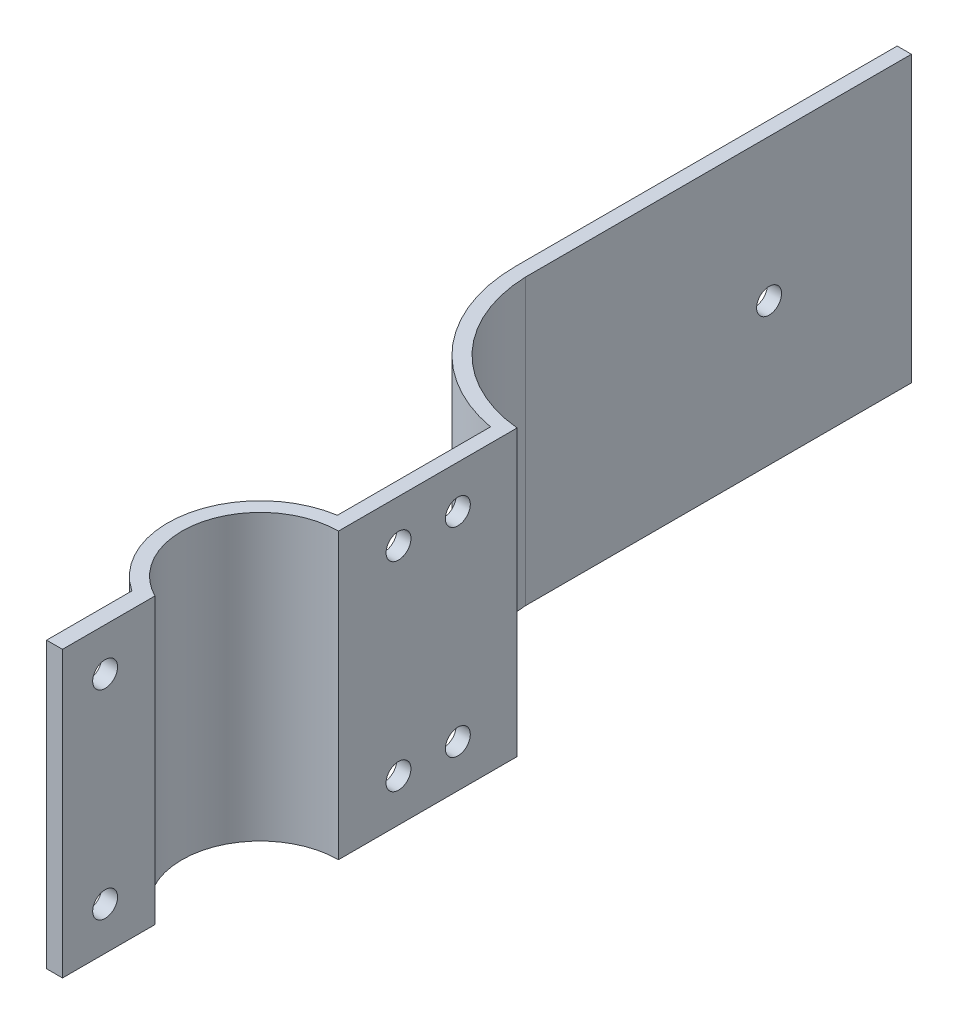
ISO-10303-21;
HEADER;
FILE_DESCRIPTION(('STEP AP214'),'2;1');
FILE_NAME('part.step','',(''),(''),'','','');
FILE_SCHEMA(('AUTOMOTIVE_DESIGN { 1 0 10303 214 1 1 1 1 }'));
ENDSEC;
DATA;
#1=APPLICATION_CONTEXT('core data for automotive mechanical design processes');
#2=APPLICATION_PROTOCOL_DEFINITION('international standard','automotive_design',2000,#1);
#3=PRODUCT_CONTEXT('',#1,'mechanical');
#4=PRODUCT('Part','Part','',(#3));
#5=PRODUCT_RELATED_PRODUCT_CATEGORY('part','',(#4));
#6=PRODUCT_DEFINITION_FORMATION('','',#4);
#7=PRODUCT_DEFINITION_CONTEXT('part definition',#1,'design');
#8=PRODUCT_DEFINITION('design','',#6,#7);
#9=PRODUCT_DEFINITION_SHAPE('','',#8);
#10=(LENGTH_UNIT() NAMED_UNIT(*) SI_UNIT(.MILLI.,.METRE.));
#11=(NAMED_UNIT(*) PLANE_ANGLE_UNIT() SI_UNIT($,.RADIAN.));
#12=(NAMED_UNIT(*) SI_UNIT($,.STERADIAN.) SOLID_ANGLE_UNIT());
#13=UNCERTAINTY_MEASURE_WITH_UNIT(LENGTH_MEASURE(1.E-05),#10,'distance_accuracy_value','');
#14=(GEOMETRIC_REPRESENTATION_CONTEXT(3) GLOBAL_UNCERTAINTY_ASSIGNED_CONTEXT((#13)) GLOBAL_UNIT_ASSIGNED_CONTEXT((#10,
#11,#12)) REPRESENTATION_CONTEXT('',''));
#15=CARTESIAN_POINT('',(0.,0.,0.));
#16=DIRECTION('',(0.,0.,1.));
#17=DIRECTION('',(1.,0.,0.));
#18=AXIS2_PLACEMENT_3D('',#15,#16,#17);
#19=CARTESIAN_POINT('',(0.,40.,0.));
#20=DIRECTION('',(0.,-1.,0.));
#21=DIRECTION('',(0.,0.,-1.));
#22=AXIS2_PLACEMENT_3D('',#19,#20,#21);
#23=CYLINDRICAL_SURFACE('',#22,11.);
#24=CARTESIAN_POINT('',(0.,0.,0.));
#25=DIRECTION('',(0.,-1.,0.));
#26=DIRECTION('',(0.,0.,1.));
#27=AXIS2_PLACEMENT_3D('',#24,#25,#26);
#28=CIRCLE('',#27,11.);
#29=CARTESIAN_POINT('',(-4.99999999999999,0.,9.79795897113272));
#30=VERTEX_POINT('',#29);
#31=CARTESIAN_POINT('',(0.,0.,-11.));
#32=VERTEX_POINT('',#31);
#33=EDGE_CURVE('E607',#30,#32,#28,.T.);
#34=ORIENTED_EDGE('',*,*,#33,.T.);
#35=DIRECTION('',(0.,-1.,0.));
#36=VECTOR('',#35,1.);
#37=CARTESIAN_POINT('',(0.,40.,-11.));
#38=LINE('',#37,#36);
#39=CARTESIAN_POINT('',(0.,40.,-11.));
#40=VERTEX_POINT('',#39);
#41=EDGE_CURVE('E129',#40,#32,#38,.T.);
#42=ORIENTED_EDGE('',*,*,#41,.F.);
#43=CARTESIAN_POINT('',(0.,40.,0.));
#44=DIRECTION('',(0.,-1.,0.));
#45=DIRECTION('',(0.,0.,1.));
#46=AXIS2_PLACEMENT_3D('',#43,#44,#45);
#47=CIRCLE('',#46,11.);
#48=CARTESIAN_POINT('',(-4.99999999999999,40.,9.79795897113272));
#49=VERTEX_POINT('',#48);
#50=EDGE_CURVE('E630',#49,#40,#47,.T.);
#51=ORIENTED_EDGE('',*,*,#50,.F.);
#52=DIRECTION('',(0.,-1.,0.));
#53=VECTOR('',#52,1.);
#54=CARTESIAN_POINT('',(-4.99999999999999,40.,9.79795897113272));
#55=LINE('',#54,#53);
#56=EDGE_CURVE('E603',#49,#30,#55,.T.);
#57=ORIENTED_EDGE('',*,*,#56,.T.);
#58=EDGE_LOOP('',(#34,#42,#51,#57));
#59=FACE_BOUND('',#58,.T.);
#60=ADVANCED_FACE('F485',(#59),#23,.F.);
#61=CARTESIAN_POINT('',(0.,40.,-11.));
#62=DIRECTION('',(-1.,0.,0.));
#63=DIRECTION('',(0.,0.,1.));
#64=AXIS2_PLACEMENT_3D('',#61,#62,#63);
#65=PLANE('',#64);
#66=CARTESIAN_POINT('',(0.,34.,-19.4346127644844));
#67=DIRECTION('',(-1.,0.,0.));
#68=DIRECTION('',(0.,0.,1.));
#69=AXIS2_PLACEMENT_3D('',#66,#67,#68);
#70=CIRCLE('',#69,1.75);
#71=CARTESIAN_POINT('',(0.,34.,-17.6846127644844));
#72=VERTEX_POINT('',#71);
#73=EDGE_CURVE('E771',#72,#72,#70,.T.);
#74=ORIENTED_EDGE('',*,*,#73,.T.);
#75=EDGE_LOOP('',(#74));
#76=FACE_BOUND('',#75,.T.);
#77=CARTESIAN_POINT('',(0.,6.,-19.4346127644844));
#78=DIRECTION('',(-1.,0.,0.));
#79=DIRECTION('',(0.,0.,-1.));
#80=AXIS2_PLACEMENT_3D('',#77,#78,#79);
#81=CIRCLE('',#80,1.75);
#82=CARTESIAN_POINT('',(0.,6.,-21.1846127644844));
#83=VERTEX_POINT('',#82);
#84=EDGE_CURVE('E775',#83,#83,#81,.T.);
#85=ORIENTED_EDGE('',*,*,#84,.T.);
#86=EDGE_LOOP('',(#85));
#87=FACE_BOUND('',#86,.T.);
#88=CARTESIAN_POINT('',(0.,6.,-27.7739929503036));
#89=DIRECTION('',(-1.,0.,0.));
#90=DIRECTION('',(0.,0.,-1.));
#91=AXIS2_PLACEMENT_3D('',#88,#89,#90);
#92=CIRCLE('',#91,1.75);
#93=CARTESIAN_POINT('',(0.,6.,-29.5239929503036));
#94=VERTEX_POINT('',#93);
#95=EDGE_CURVE('E777',#94,#94,#92,.T.);
#96=ORIENTED_EDGE('',*,*,#95,.T.);
#97=EDGE_LOOP('',(#96));
#98=FACE_BOUND('',#97,.T.);
#99=CARTESIAN_POINT('',(0.,34.,-27.7739929503036));
#100=DIRECTION('',(-1.,0.,0.));
#101=DIRECTION('',(0.,0.,1.));
#102=AXIS2_PLACEMENT_3D('',#99,#100,#101);
#103=CIRCLE('',#102,1.75);
#104=CARTESIAN_POINT('',(0.,34.,-26.0239929503036));
#105=VERTEX_POINT('',#104);
#106=EDGE_CURVE('E658',#105,#105,#103,.T.);
#107=ORIENTED_EDGE('',*,*,#106,.T.);
#108=EDGE_LOOP('',(#107));
#109=FACE_BOUND('',#108,.T.);
#110=DIRECTION('',(0.,0.,-1.));
#111=VECTOR('',#110,1.);
#112=CARTESIAN_POINT('',(0.,0.,-11.));
#113=LINE('',#112,#111);
#114=CARTESIAN_POINT('',(0.,0.,-36.0988023049347));
#115=VERTEX_POINT('',#114);
#116=EDGE_CURVE('E610',#32,#115,#113,.T.);
#117=ORIENTED_EDGE('',*,*,#116,.T.);
#118=DIRECTION('',(0.,-1.,0.));
#119=VECTOR('',#118,1.);
#120=CARTESIAN_POINT('',(0.,40.,-36.0988023049347));
#121=LINE('',#120,#119);
#122=CARTESIAN_POINT('',(0.,40.,-36.0988023049347));
#123=VERTEX_POINT('',#122);
#124=EDGE_CURVE('E494',#123,#115,#121,.T.);
#125=ORIENTED_EDGE('',*,*,#124,.F.);
#126=DIRECTION('',(0.,0.,-1.));
#127=VECTOR('',#126,1.);
#128=CARTESIAN_POINT('',(0.,40.,-11.));
#129=LINE('',#128,#127);
#130=EDGE_CURVE('E558',#40,#123,#129,.T.);
#131=ORIENTED_EDGE('',*,*,#130,.F.);
#132=ORIENTED_EDGE('',*,*,#41,.T.);
#133=EDGE_LOOP('',(#117,#125,#131,#132));
#134=FACE_BOUND('',#133,.T.);
#135=ADVANCED_FACE('F725',(#76,#87,#98,#109,#134),#65,.F.);
#136=CARTESIAN_POINT('',(1.91437516293724,40.,-55.7074706610221));
#137=DIRECTION('',(0.,-1.,0.));
#138=DIRECTION('',(0.,0.,-1.));
#139=AXIS2_PLACEMENT_3D('',#136,#137,#138);
#140=CYLINDRICAL_SURFACE('',#139,19.7018960245834);
#141=CARTESIAN_POINT('',(1.91437516293724,0.,-55.7074706610221));
#142=DIRECTION('',(0.,-1.,0.));
#143=DIRECTION('',(0.,0.,-1.));
#144=AXIS2_PLACEMENT_3D('',#141,#142,#143);
#145=CIRCLE('',#144,19.7018960245834);
#146=CARTESIAN_POINT('',(-17.776180483744,0.,-55.0390955504403));
#147=VERTEX_POINT('',#146);
#148=EDGE_CURVE('E613',#115,#147,#145,.T.);
#149=ORIENTED_EDGE('',*,*,#148,.T.);
#150=DIRECTION('',(0.,-1.,0.));
#151=VECTOR('',#150,1.);
#152=CARTESIAN_POINT('',(-17.776180483744,40.,-55.0390955504403));
#153=LINE('',#152,#151);
#154=CARTESIAN_POINT('',(-17.776180483744,40.,-55.0390955504403));
#155=VERTEX_POINT('',#154);
#156=EDGE_CURVE('E649',#155,#147,#153,.T.);
#157=ORIENTED_EDGE('',*,*,#156,.F.);
#158=CARTESIAN_POINT('',(1.91437516293724,40.,-55.7074706610221));
#159=DIRECTION('',(0.,-1.,0.));
#160=DIRECTION('',(0.,0.,-1.));
#161=AXIS2_PLACEMENT_3D('',#158,#159,#160);
#162=CIRCLE('',#161,19.7018960245834);
#163=EDGE_CURVE('E684',#123,#155,#162,.T.);
#164=ORIENTED_EDGE('',*,*,#163,.F.);
#165=ORIENTED_EDGE('',*,*,#124,.T.);
#166=EDGE_LOOP('',(#149,#157,#164,#165));
#167=FACE_BOUND('',#166,.T.);
#168=ADVANCED_FACE('F729',(#167),#140,.F.);
#169=CARTESIAN_POINT('',(-17.776180483744,40.,-109.287361941158));
#170=DIRECTION('',(-1.,0.,0.));
#171=DIRECTION('',(0.,0.,1.));
#172=AXIS2_PLACEMENT_3D('',#169,#170,#171);
#173=PLANE('',#172);
#174=CARTESIAN_POINT('',(-17.776180483744,20.,-89.2873619411582));
#175=DIRECTION('',(-1.,0.,0.));
#176=DIRECTION('',(0.,0.,1.));
#177=AXIS2_PLACEMENT_3D('',#174,#175,#176);
#178=CIRCLE('',#177,1.75);
#179=CARTESIAN_POINT('',(-17.776180483744,20.,-87.5373619411581));
#180=VERTEX_POINT('',#179);
#181=EDGE_CURVE('E611',#180,#180,#178,.T.);
#182=ORIENTED_EDGE('',*,*,#181,.T.);
#183=EDGE_LOOP('',(#182));
#184=FACE_BOUND('',#183,.T.);
#185=DIRECTION('',(0.,0.,-1.));
#186=VECTOR('',#185,1.);
#187=CARTESIAN_POINT('',(-17.776180483744,0.,-109.287361941158));
#188=LINE('',#187,#186);
#189=CARTESIAN_POINT('',(-17.776180483744,0.,-109.287361941158));
#190=VERTEX_POINT('',#189);
#191=EDGE_CURVE('E615',#147,#190,#188,.T.);
#192=ORIENTED_EDGE('',*,*,#191,.T.);
#193=DIRECTION('',(0.,-1.,0.));
#194=VECTOR('',#193,1.);
#195=CARTESIAN_POINT('',(-17.776180483744,40.,-109.287361941158));
#196=LINE('',#195,#194);
#197=CARTESIAN_POINT('',(-17.776180483744,40.,-109.287361941158));
#198=VERTEX_POINT('',#197);
#199=EDGE_CURVE('E646',#198,#190,#196,.T.);
#200=ORIENTED_EDGE('',*,*,#199,.F.);
#201=DIRECTION('',(0.,0.,-1.));
#202=VECTOR('',#201,1.);
#203=CARTESIAN_POINT('',(-17.776180483744,40.,-109.287361941158));
#204=LINE('',#203,#202);
#205=EDGE_CURVE('E686',#155,#198,#204,.T.);
#206=ORIENTED_EDGE('',*,*,#205,.F.);
#207=ORIENTED_EDGE('',*,*,#156,.T.);
#208=EDGE_LOOP('',(#192,#200,#206,#207));
#209=FACE_BOUND('',#208,.T.);
#210=ADVANCED_FACE('F734',(#184,#209),#173,.F.);
#211=CARTESIAN_POINT('',(-19.776180483744,40.,-109.287361941158));
#212=DIRECTION('',(0.,0.,1.));
#213=DIRECTION('',(1.,0.,0.));
#214=AXIS2_PLACEMENT_3D('',#211,#212,#213);
#215=PLANE('',#214);
#216=DIRECTION('',(-1.,0.,0.));
#217=VECTOR('',#216,1.);
#218=CARTESIAN_POINT('',(-19.776180483744,0.,-109.287361941158));
#219=LINE('',#218,#217);
#220=CARTESIAN_POINT('',(-19.776180483744,0.,-109.287361941158));
#221=VERTEX_POINT('',#220);
#222=EDGE_CURVE('E617',#190,#221,#219,.T.);
#223=ORIENTED_EDGE('',*,*,#222,.T.);
#224=DIRECTION('',(0.,-1.,0.));
#225=VECTOR('',#224,1.);
#226=CARTESIAN_POINT('',(-19.776180483744,40.,-109.287361941158));
#227=LINE('',#226,#225);
#228=CARTESIAN_POINT('',(-19.776180483744,40.,-109.287361941158));
#229=VERTEX_POINT('',#228);
#230=EDGE_CURVE('E643',#229,#221,#227,.T.);
#231=ORIENTED_EDGE('',*,*,#230,.F.);
#232=DIRECTION('',(-1.,0.,0.));
#233=VECTOR('',#232,1.);
#234=CARTESIAN_POINT('',(-19.776180483744,40.,-109.287361941158));
#235=LINE('',#234,#233);
#236=EDGE_CURVE('E688',#198,#229,#235,.T.);
#237=ORIENTED_EDGE('',*,*,#236,.F.);
#238=ORIENTED_EDGE('',*,*,#199,.T.);
#239=EDGE_LOOP('',(#223,#231,#237,#238));
#240=FACE_BOUND('',#239,.T.);
#241=ADVANCED_FACE('F742',(#240),#215,.F.);
#242=CARTESIAN_POINT('',(-19.776180483744,40.,-55.700978031366));
#243=DIRECTION('',(1.,0.,0.));
#244=DIRECTION('',(0.,0.,-1.));
#245=AXIS2_PLACEMENT_3D('',#242,#243,#244);
#246=PLANE('',#245);
#247=CARTESIAN_POINT('',(-19.776180483744,20.,-89.2873619411582));
#248=DIRECTION('',(-1.,0.,0.));
#249=DIRECTION('',(0.,0.,1.));
#250=AXIS2_PLACEMENT_3D('',#247,#248,#249);
#251=CIRCLE('',#250,1.75);
#252=CARTESIAN_POINT('',(-19.776180483744,20.,-87.5373619411581));
#253=VERTEX_POINT('',#252);
#254=EDGE_CURVE('E772',#253,#253,#251,.T.);
#255=ORIENTED_EDGE('',*,*,#254,.F.);
#256=EDGE_LOOP('',(#255));
#257=FACE_BOUND('',#256,.T.);
#258=DIRECTION('',(0.,0.,1.));
#259=VECTOR('',#258,1.);
#260=CARTESIAN_POINT('',(-19.776180483744,0.,-55.700978031366));
#261=LINE('',#260,#259);
#262=CARTESIAN_POINT('',(-19.776180483744,0.,-55.700978031366));
#263=VERTEX_POINT('',#262);
#264=EDGE_CURVE('E619',#221,#263,#261,.T.);
#265=ORIENTED_EDGE('',*,*,#264,.T.);
#266=DIRECTION('',(0.,-1.,0.));
#267=VECTOR('',#266,1.);
#268=CARTESIAN_POINT('',(-19.776180483744,40.,-55.700978031366));
#269=LINE('',#268,#267);
#270=CARTESIAN_POINT('',(-19.776180483744,40.,-55.700978031366));
#271=VERTEX_POINT('',#270);
#272=EDGE_CURVE('E640',#271,#263,#269,.T.);
#273=ORIENTED_EDGE('',*,*,#272,.F.);
#274=DIRECTION('',(0.,0.,1.));
#275=VECTOR('',#274,1.);
#276=CARTESIAN_POINT('',(-19.776180483744,40.,-55.700978031366));
#277=LINE('',#276,#275);
#278=EDGE_CURVE('E690',#229,#271,#277,.T.);
#279=ORIENTED_EDGE('',*,*,#278,.F.);
#280=ORIENTED_EDGE('',*,*,#230,.T.);
#281=EDGE_LOOP('',(#265,#273,#279,#280));
#282=FACE_BOUND('',#281,.T.);
#283=ADVANCED_FACE('F745',(#257,#282),#246,.F.);
#284=CARTESIAN_POINT('',(1.91818676127452,40.,-55.700978031366));
#285=DIRECTION('',(0.,-1.,0.));
#286=DIRECTION('',(0.,0.,-1.));
#287=AXIS2_PLACEMENT_3D('',#284,#285,#286);
#288=CYLINDRICAL_SURFACE('',#287,21.6943672450185);
#289=CARTESIAN_POINT('',(1.91818676127452,0.,-55.700978031366));
#290=DIRECTION('',(0.,1.,0.));
#291=DIRECTION('',(0.,0.,-1.));
#292=AXIS2_PLACEMENT_3D('',#289,#290,#291);
#293=CIRCLE('',#292,21.6943672450185);
#294=CARTESIAN_POINT('',(-1.99999999999999,0.,-34.3633731361228));
#295=VERTEX_POINT('',#294);
#296=EDGE_CURVE('E621',#263,#295,#293,.T.);
#297=ORIENTED_EDGE('',*,*,#296,.T.);
#298=DIRECTION('',(0.,-1.,0.));
#299=VECTOR('',#298,1.);
#300=CARTESIAN_POINT('',(-1.99999999999999,40.,-34.3633731361228));
#301=LINE('',#300,#299);
#302=CARTESIAN_POINT('',(-1.99999999999999,40.,-34.3633731361228));
#303=VERTEX_POINT('',#302);
#304=EDGE_CURVE('E637',#303,#295,#301,.T.);
#305=ORIENTED_EDGE('',*,*,#304,.F.);
#306=CARTESIAN_POINT('',(1.91818676127452,40.,-55.700978031366));
#307=DIRECTION('',(0.,1.,0.));
#308=DIRECTION('',(0.,0.,-1.));
#309=AXIS2_PLACEMENT_3D('',#306,#307,#308);
#310=CIRCLE('',#309,21.6943672450185);
#311=EDGE_CURVE('E692',#271,#303,#310,.T.);
#312=ORIENTED_EDGE('',*,*,#311,.F.);
#313=ORIENTED_EDGE('',*,*,#272,.T.);
#314=EDGE_LOOP('',(#297,#305,#312,#313));
#315=FACE_BOUND('',#314,.T.);
#316=ADVANCED_FACE('F749',(#315),#288,.T.);
#317=CARTESIAN_POINT('',(-2.,40.,-12.8452325786651));
#318=DIRECTION('',(1.,0.,0.));
#319=DIRECTION('',(0.,0.,-1.));
#320=AXIS2_PLACEMENT_3D('',#317,#318,#319);
#321=PLANE('',#320);
#322=CARTESIAN_POINT('',(-2.,34.,-19.4346127644844));
#323=DIRECTION('',(1.,0.,0.));
#324=DIRECTION('',(0.,0.,-1.));
#325=AXIS2_PLACEMENT_3D('',#322,#323,#324);
#326=CIRCLE('',#325,1.75);
#327=CARTESIAN_POINT('',(-2.,34.,-21.1846127644844));
#328=VERTEX_POINT('',#327);
#329=EDGE_CURVE('E488',#328,#328,#326,.T.);
#330=ORIENTED_EDGE('',*,*,#329,.T.);
#331=EDGE_LOOP('',(#330));
#332=FACE_BOUND('',#331,.T.);
#333=CARTESIAN_POINT('',(-2.,6.,-19.4346127644844));
#334=DIRECTION('',(1.,0.,0.));
#335=DIRECTION('',(0.,0.,-1.));
#336=AXIS2_PLACEMENT_3D('',#333,#334,#335);
#337=CIRCLE('',#336,1.75);
#338=CARTESIAN_POINT('',(-2.,6.,-21.1846127644844));
#339=VERTEX_POINT('',#338);
#340=EDGE_CURVE('E668',#339,#339,#337,.T.);
#341=ORIENTED_EDGE('',*,*,#340,.T.);
#342=EDGE_LOOP('',(#341));
#343=FACE_BOUND('',#342,.T.);
#344=CARTESIAN_POINT('',(-1.99999999999999,6.,-27.7739929503036));
#345=DIRECTION('',(1.,0.,0.));
#346=DIRECTION('',(0.,0.,-1.));
#347=AXIS2_PLACEMENT_3D('',#344,#345,#346);
#348=CIRCLE('',#347,1.75);
#349=CARTESIAN_POINT('',(-1.99999999999999,6.,-29.5239929503036));
#350=VERTEX_POINT('',#349);
#351=EDGE_CURVE('E666',#350,#350,#348,.T.);
#352=ORIENTED_EDGE('',*,*,#351,.T.);
#353=EDGE_LOOP('',(#352));
#354=FACE_BOUND('',#353,.T.);
#355=CARTESIAN_POINT('',(-1.99999999999999,34.,-27.7739929503036));
#356=DIRECTION('',(1.,0.,0.));
#357=DIRECTION('',(0.,0.,-1.));
#358=AXIS2_PLACEMENT_3D('',#355,#356,#357);
#359=CIRCLE('',#358,1.75);
#360=CARTESIAN_POINT('',(-1.99999999999999,34.,-29.5239929503036));
#361=VERTEX_POINT('',#360);
#362=EDGE_CURVE('E663',#361,#361,#359,.T.);
#363=ORIENTED_EDGE('',*,*,#362,.T.);
#364=EDGE_LOOP('',(#363));
#365=FACE_BOUND('',#364,.T.);
#366=DIRECTION('',(0.,0.,1.));
#367=VECTOR('',#366,1.);
#368=CARTESIAN_POINT('',(-2.,0.,-12.8452325786651));
#369=LINE('',#368,#367);
#370=CARTESIAN_POINT('',(-2.,0.,-12.8452325786651));
#371=VERTEX_POINT('',#370);
#372=EDGE_CURVE('E623',#295,#371,#369,.T.);
#373=ORIENTED_EDGE('',*,*,#372,.T.);
#374=DIRECTION('',(0.,-1.,0.));
#375=VECTOR('',#374,1.);
#376=CARTESIAN_POINT('',(-2.,40.,-12.8452325786651));
#377=LINE('',#376,#375);
#378=CARTESIAN_POINT('',(-2.,40.,-12.8452325786651));
#379=VERTEX_POINT('',#378);
#380=EDGE_CURVE('E634',#379,#371,#377,.T.);
#381=ORIENTED_EDGE('',*,*,#380,.F.);
#382=DIRECTION('',(0.,0.,1.));
#383=VECTOR('',#382,1.);
#384=CARTESIAN_POINT('',(-2.,40.,-12.8452325786651));
#385=LINE('',#384,#383);
#386=EDGE_CURVE('E694',#303,#379,#385,.T.);
#387=ORIENTED_EDGE('',*,*,#386,.F.);
#388=ORIENTED_EDGE('',*,*,#304,.T.);
#389=EDGE_LOOP('',(#373,#381,#387,#388));
#390=FACE_BOUND('',#389,.T.);
#391=ADVANCED_FACE('F700',(#332,#343,#354,#365,#390),#321,.F.);
#392=CARTESIAN_POINT('',(0.,40.,0.));
#393=DIRECTION('',(0.,-1.,0.));
#394=DIRECTION('',(0.,0.,-1.));
#395=AXIS2_PLACEMENT_3D('',#392,#393,#394);
#396=CYLINDRICAL_SURFACE('',#395,13.);
#397=CARTESIAN_POINT('',(0.,0.,0.));
#398=DIRECTION('',(0.,1.,0.));
#399=DIRECTION('',(0.,0.,1.));
#400=AXIS2_PLACEMENT_3D('',#397,#398,#399);
#401=CIRCLE('',#400,13.);
#402=CARTESIAN_POINT('',(-7.23403936183649,0.,10.8013274420971));
#403=VERTEX_POINT('',#402);
#404=EDGE_CURVE('E625',#371,#403,#401,.T.);
#405=ORIENTED_EDGE('',*,*,#404,.T.);
#406=DIRECTION('',(0.,-1.,0.));
#407=VECTOR('',#406,1.);
#408=CARTESIAN_POINT('',(-7.23403936183649,40.,10.8013274420971));
#409=LINE('',#408,#407);
#410=CARTESIAN_POINT('',(-7.23403936183649,40.,10.8013274420971));
#411=VERTEX_POINT('',#410);
#412=EDGE_CURVE('E598',#411,#403,#409,.T.);
#413=ORIENTED_EDGE('',*,*,#412,.F.);
#414=CARTESIAN_POINT('',(0.,40.,0.));
#415=DIRECTION('',(0.,1.,0.));
#416=DIRECTION('',(0.,0.,1.));
#417=AXIS2_PLACEMENT_3D('',#414,#415,#416);
#418=CIRCLE('',#417,13.);
#419=EDGE_CURVE('E589',#379,#411,#418,.T.);
#420=ORIENTED_EDGE('',*,*,#419,.F.);
#421=ORIENTED_EDGE('',*,*,#380,.T.);
#422=EDGE_LOOP('',(#405,#413,#420,#421));
#423=FACE_BOUND('',#422,.T.);
#424=ADVANCED_FACE('F704',(#423),#396,.T.);
#425=CARTESIAN_POINT('',(-7.23403936183649,40.,22.783960597708));
#426=DIRECTION('',(1.,0.,0.));
#427=DIRECTION('',(0.,0.,-1.));
#428=AXIS2_PLACEMENT_3D('',#425,#426,#427);
#429=PLANE('',#428);
#430=CARTESIAN_POINT('',(-7.23403936183649,34.,16.7926440199026));
#431=DIRECTION('',(1.,0.,0.));
#432=DIRECTION('',(0.,0.,-1.));
#433=AXIS2_PLACEMENT_3D('',#430,#431,#432);
#434=CIRCLE('',#433,1.75);
#435=CARTESIAN_POINT('',(-7.23403936183649,34.,15.0426440199026));
#436=VERTEX_POINT('',#435);
#437=EDGE_CURVE('E662',#436,#436,#434,.T.);
#438=ORIENTED_EDGE('',*,*,#437,.T.);
#439=EDGE_LOOP('',(#438));
#440=FACE_BOUND('',#439,.T.);
#441=CARTESIAN_POINT('',(-7.23403936183649,6.,16.7926440199026));
#442=DIRECTION('',(1.,0.,0.));
#443=DIRECTION('',(0.,0.,-1.));
#444=AXIS2_PLACEMENT_3D('',#441,#442,#443);
#445=CIRCLE('',#444,1.75);
#446=CARTESIAN_POINT('',(-7.23403936183649,6.,15.0426440199026));
#447=VERTEX_POINT('',#446);
#448=EDGE_CURVE('E657',#447,#447,#445,.T.);
#449=ORIENTED_EDGE('',*,*,#448,.T.);
#450=EDGE_LOOP('',(#449));
#451=FACE_BOUND('',#450,.T.);
#452=DIRECTION('',(0.,0.,1.));
#453=VECTOR('',#452,1.);
#454=CARTESIAN_POINT('',(-7.23403936183649,0.,22.783960597708));
#455=LINE('',#454,#453);
#456=CARTESIAN_POINT('',(-7.23403936183649,0.,22.783960597708));
#457=VERTEX_POINT('',#456);
#458=EDGE_CURVE('E597',#403,#457,#455,.T.);
#459=ORIENTED_EDGE('',*,*,#458,.T.);
#460=DIRECTION('',(0.,-1.,0.));
#461=VECTOR('',#460,1.);
#462=CARTESIAN_POINT('',(-7.23403936183649,40.,22.783960597708));
#463=LINE('',#462,#461);
#464=CARTESIAN_POINT('',(-7.23403936183649,40.,22.783960597708));
#465=VERTEX_POINT('',#464);
#466=EDGE_CURVE('E594',#465,#457,#463,.T.);
#467=ORIENTED_EDGE('',*,*,#466,.F.);
#468=DIRECTION('',(0.,0.,1.));
#469=VECTOR('',#468,1.);
#470=CARTESIAN_POINT('',(-7.23403936183649,40.,22.783960597708));
#471=LINE('',#470,#469);
#472=EDGE_CURVE('E583',#411,#465,#471,.T.);
#473=ORIENTED_EDGE('',*,*,#472,.F.);
#474=ORIENTED_EDGE('',*,*,#412,.T.);
#475=EDGE_LOOP('',(#459,#467,#473,#474));
#476=FACE_BOUND('',#475,.T.);
#477=ADVANCED_FACE('F595',(#440,#451,#476),#429,.F.);
#478=CARTESIAN_POINT('',(-4.99999999999998,40.,22.783960597708));
#479=DIRECTION('',(0.,0.,-1.));
#480=DIRECTION('',(-1.,0.,0.));
#481=AXIS2_PLACEMENT_3D('',#478,#479,#480);
#482=PLANE('',#481);
#483=DIRECTION('',(1.,0.,0.));
#484=VECTOR('',#483,1.);
#485=CARTESIAN_POINT('',(-4.99999999999998,0.,22.783960597708));
#486=LINE('',#485,#484);
#487=CARTESIAN_POINT('',(-4.99999999999998,0.,22.783960597708));
#488=VERTEX_POINT('',#487);
#489=EDGE_CURVE('E544',#457,#488,#486,.T.);
#490=ORIENTED_EDGE('',*,*,#489,.T.);
#491=DIRECTION('',(0.,-1.,0.));
#492=VECTOR('',#491,1.);
#493=CARTESIAN_POINT('',(-4.99999999999998,40.,22.783960597708));
#494=LINE('',#493,#492);
#495=CARTESIAN_POINT('',(-4.99999999999998,40.,22.783960597708));
#496=VERTEX_POINT('',#495);
#497=EDGE_CURVE('E599',#496,#488,#494,.T.);
#498=ORIENTED_EDGE('',*,*,#497,.F.);
#499=DIRECTION('',(1.,0.,0.));
#500=VECTOR('',#499,1.);
#501=CARTESIAN_POINT('',(-4.99999999999998,40.,22.783960597708));
#502=LINE('',#501,#500);
#503=EDGE_CURVE('E587',#465,#496,#502,.T.);
#504=ORIENTED_EDGE('',*,*,#503,.F.);
#505=ORIENTED_EDGE('',*,*,#466,.T.);
#506=EDGE_LOOP('',(#490,#498,#504,#505));
#507=FACE_BOUND('',#506,.T.);
#508=ADVANCED_FACE('F601',(#507),#482,.F.);
#509=CARTESIAN_POINT('',(-4.99999999999999,40.,9.79795897113272));
#510=DIRECTION('',(-1.,0.,0.));
#511=DIRECTION('',(0.,0.,1.));
#512=AXIS2_PLACEMENT_3D('',#509,#510,#511);
#513=PLANE('',#512);
#514=CARTESIAN_POINT('',(-4.99999999999998,34.,16.7926440199026));
#515=DIRECTION('',(-1.,0.,0.));
#516=DIRECTION('',(0.,0.,1.));
#517=AXIS2_PLACEMENT_3D('',#514,#515,#516);
#518=CIRCLE('',#517,1.75);
#519=CARTESIAN_POINT('',(-4.99999999999998,34.,18.5426440199026));
#520=VERTEX_POINT('',#519);
#521=EDGE_CURVE('E659',#520,#520,#518,.T.);
#522=ORIENTED_EDGE('',*,*,#521,.T.);
#523=EDGE_LOOP('',(#522));
#524=FACE_BOUND('',#523,.T.);
#525=CARTESIAN_POINT('',(-4.99999999999998,6.,16.7926440199026));
#526=DIRECTION('',(-1.,0.,0.));
#527=DIRECTION('',(0.,0.,1.));
#528=AXIS2_PLACEMENT_3D('',#525,#526,#527);
#529=CIRCLE('',#528,1.75);
#530=CARTESIAN_POINT('',(-4.99999999999998,6.,18.5426440199026));
#531=VERTEX_POINT('',#530);
#532=EDGE_CURVE('E654',#531,#531,#529,.T.);
#533=ORIENTED_EDGE('',*,*,#532,.T.);
#534=EDGE_LOOP('',(#533));
#535=FACE_BOUND('',#534,.T.);
#536=DIRECTION('',(0.,0.,-1.));
#537=VECTOR('',#536,1.);
#538=CARTESIAN_POINT('',(-4.99999999999999,0.,9.79795897113272));
#539=LINE('',#538,#537);
#540=EDGE_CURVE('E550',#488,#30,#539,.T.);
#541=ORIENTED_EDGE('',*,*,#540,.T.);
#542=ORIENTED_EDGE('',*,*,#56,.F.);
#543=DIRECTION('',(0.,0.,-1.));
#544=VECTOR('',#543,1.);
#545=CARTESIAN_POINT('',(-4.99999999999999,40.,9.79795897113272));
#546=LINE('',#545,#544);
#547=EDGE_CURVE('E503',#496,#49,#546,.T.);
#548=ORIENTED_EDGE('',*,*,#547,.F.);
#549=ORIENTED_EDGE('',*,*,#497,.T.);
#550=EDGE_LOOP('',(#541,#542,#548,#549));
#551=FACE_BOUND('',#550,.T.);
#552=ADVANCED_FACE('F712',(#524,#535,#551),#513,.F.);
#553=CARTESIAN_POINT('',(0.,40.,0.));
#554=DIRECTION('',(0.,1.,0.));
#555=DIRECTION('',(0.,0.,1.));
#556=AXIS2_PLACEMENT_3D('',#553,#554,#555);
#557=PLANE('',#556);
#558=ORIENTED_EDGE('',*,*,#50,.T.);
#559=ORIENTED_EDGE('',*,*,#130,.T.);
#560=ORIENTED_EDGE('',*,*,#163,.T.);
#561=ORIENTED_EDGE('',*,*,#205,.T.);
#562=ORIENTED_EDGE('',*,*,#236,.T.);
#563=ORIENTED_EDGE('',*,*,#278,.T.);
#564=ORIENTED_EDGE('',*,*,#311,.T.);
#565=ORIENTED_EDGE('',*,*,#386,.T.);
#566=ORIENTED_EDGE('',*,*,#419,.T.);
#567=ORIENTED_EDGE('',*,*,#472,.T.);
#568=ORIENTED_EDGE('',*,*,#503,.T.);
#569=ORIENTED_EDGE('',*,*,#547,.T.);
#570=EDGE_LOOP('',(#558,#559,#560,#561,#562,#563,#564,#565,#566,#567,#568,#569));
#571=FACE_BOUND('',#570,.T.);
#572=ADVANCED_FACE('F585',(#571),#557,.T.);
#573=CARTESIAN_POINT('',(0.,0.,0.));
#574=DIRECTION('',(0.,1.,0.));
#575=DIRECTION('',(0.,0.,1.));
#576=AXIS2_PLACEMENT_3D('',#573,#574,#575);
#577=PLANE('',#576);
#578=ORIENTED_EDGE('',*,*,#33,.F.);
#579=ORIENTED_EDGE('',*,*,#540,.F.);
#580=ORIENTED_EDGE('',*,*,#489,.F.);
#581=ORIENTED_EDGE('',*,*,#458,.F.);
#582=ORIENTED_EDGE('',*,*,#404,.F.);
#583=ORIENTED_EDGE('',*,*,#372,.F.);
#584=ORIENTED_EDGE('',*,*,#296,.F.);
#585=ORIENTED_EDGE('',*,*,#264,.F.);
#586=ORIENTED_EDGE('',*,*,#222,.F.);
#587=ORIENTED_EDGE('',*,*,#191,.F.);
#588=ORIENTED_EDGE('',*,*,#148,.F.);
#589=ORIENTED_EDGE('',*,*,#116,.F.);
#590=EDGE_LOOP('',(#578,#579,#580,#581,#582,#583,#584,#585,#586,#587,#588,#589));
#591=FACE_BOUND('',#590,.T.);
#592=ADVANCED_FACE('F707',(#591),#577,.F.);
#593=CARTESIAN_POINT('',(0.,6.,16.7926440199026));
#594=DIRECTION('',(-1.,0.,0.));
#595=DIRECTION('',(0.,0.,1.));
#596=AXIS2_PLACEMENT_3D('',#593,#594,#595);
#597=CYLINDRICAL_SURFACE('',#596,1.75);
#598=ORIENTED_EDGE('',*,*,#532,.F.);
#599=EDGE_LOOP('',(#598));
#600=FACE_BOUND('',#599,.T.);
#601=ORIENTED_EDGE('',*,*,#448,.F.);
#602=EDGE_LOOP('',(#601));
#603=FACE_BOUND('',#602,.T.);
#604=ADVANCED_FACE('F804',(#600,#603),#597,.F.);
#605=CARTESIAN_POINT('',(0.,34.,16.7926440199026));
#606=DIRECTION('',(-1.,0.,0.));
#607=DIRECTION('',(0.,0.,1.));
#608=AXIS2_PLACEMENT_3D('',#605,#606,#607);
#609=CYLINDRICAL_SURFACE('',#608,1.75);
#610=ORIENTED_EDGE('',*,*,#521,.F.);
#611=EDGE_LOOP('',(#610));
#612=FACE_BOUND('',#611,.T.);
#613=ORIENTED_EDGE('',*,*,#437,.F.);
#614=EDGE_LOOP('',(#613));
#615=FACE_BOUND('',#614,.T.);
#616=ADVANCED_FACE('F801',(#612,#615),#609,.F.);
#617=CARTESIAN_POINT('',(0.,34.,-27.7739929503036));
#618=DIRECTION('',(-1.,0.,0.));
#619=DIRECTION('',(0.,0.,1.));
#620=AXIS2_PLACEMENT_3D('',#617,#618,#619);
#621=CYLINDRICAL_SURFACE('',#620,1.75);
#622=ORIENTED_EDGE('',*,*,#106,.F.);
#623=EDGE_LOOP('',(#622));
#624=FACE_BOUND('',#623,.T.);
#625=ORIENTED_EDGE('',*,*,#362,.F.);
#626=EDGE_LOOP('',(#625));
#627=FACE_BOUND('',#626,.T.);
#628=ADVANCED_FACE('F797',(#624,#627),#621,.F.);
#629=CARTESIAN_POINT('',(0.,6.,-27.7739929503036));
#630=DIRECTION('',(-1.,0.,0.));
#631=DIRECTION('',(0.,0.,1.));
#632=AXIS2_PLACEMENT_3D('',#629,#630,#631);
#633=CYLINDRICAL_SURFACE('',#632,1.75);
#634=ORIENTED_EDGE('',*,*,#95,.F.);
#635=EDGE_LOOP('',(#634));
#636=FACE_BOUND('',#635,.T.);
#637=ORIENTED_EDGE('',*,*,#351,.F.);
#638=EDGE_LOOP('',(#637));
#639=FACE_BOUND('',#638,.T.);
#640=ADVANCED_FACE('F788',(#636,#639),#633,.F.);
#641=CARTESIAN_POINT('',(0.,6.,-19.4346127644844));
#642=DIRECTION('',(-1.,0.,0.));
#643=DIRECTION('',(0.,0.,1.));
#644=AXIS2_PLACEMENT_3D('',#641,#642,#643);
#645=CYLINDRICAL_SURFACE('',#644,1.75);
#646=ORIENTED_EDGE('',*,*,#84,.F.);
#647=EDGE_LOOP('',(#646));
#648=FACE_BOUND('',#647,.T.);
#649=ORIENTED_EDGE('',*,*,#340,.F.);
#650=EDGE_LOOP('',(#649));
#651=FACE_BOUND('',#650,.T.);
#652=ADVANCED_FACE('F784',(#648,#651),#645,.F.);
#653=CARTESIAN_POINT('',(0.,34.,-19.4346127644844));
#654=DIRECTION('',(-1.,0.,0.));
#655=DIRECTION('',(0.,0.,1.));
#656=AXIS2_PLACEMENT_3D('',#653,#654,#655);
#657=CYLINDRICAL_SURFACE('',#656,1.75);
#658=ORIENTED_EDGE('',*,*,#73,.F.);
#659=EDGE_LOOP('',(#658));
#660=FACE_BOUND('',#659,.T.);
#661=ORIENTED_EDGE('',*,*,#329,.F.);
#662=EDGE_LOOP('',(#661));
#663=FACE_BOUND('',#662,.T.);
#664=ADVANCED_FACE('F787',(#660,#663),#657,.F.);
#665=CARTESIAN_POINT('',(0.,20.,-89.2873619411581));
#666=DIRECTION('',(-1.,0.,0.));
#667=DIRECTION('',(0.,0.,1.));
#668=AXIS2_PLACEMENT_3D('',#665,#666,#667);
#669=CYLINDRICAL_SURFACE('',#668,1.75);
#670=ORIENTED_EDGE('',*,*,#254,.T.);
#671=EDGE_LOOP('',(#670));
#672=FACE_BOUND('',#671,.T.);
#673=ORIENTED_EDGE('',*,*,#181,.F.);
#674=EDGE_LOOP('',(#673));
#675=FACE_BOUND('',#674,.T.);
#676=ADVANCED_FACE('F794',(#672,#675),#669,.F.);
#677=CLOSED_SHELL('',(#60,#135,#168,#210,#241,#283,#316,#391,#424,#477,#508,#552,#572,#592,#604,
#616,#628,#640,#652,#664,#676));
#678=MANIFOLD_SOLID_BREP('B10',#677);
#679=ADVANCED_BREP_SHAPE_REPRESENTATION('',(#18,#678),#14);
#680=SHAPE_DEFINITION_REPRESENTATION(#9,#679);
ENDSEC;
END-ISO-10303-21;
